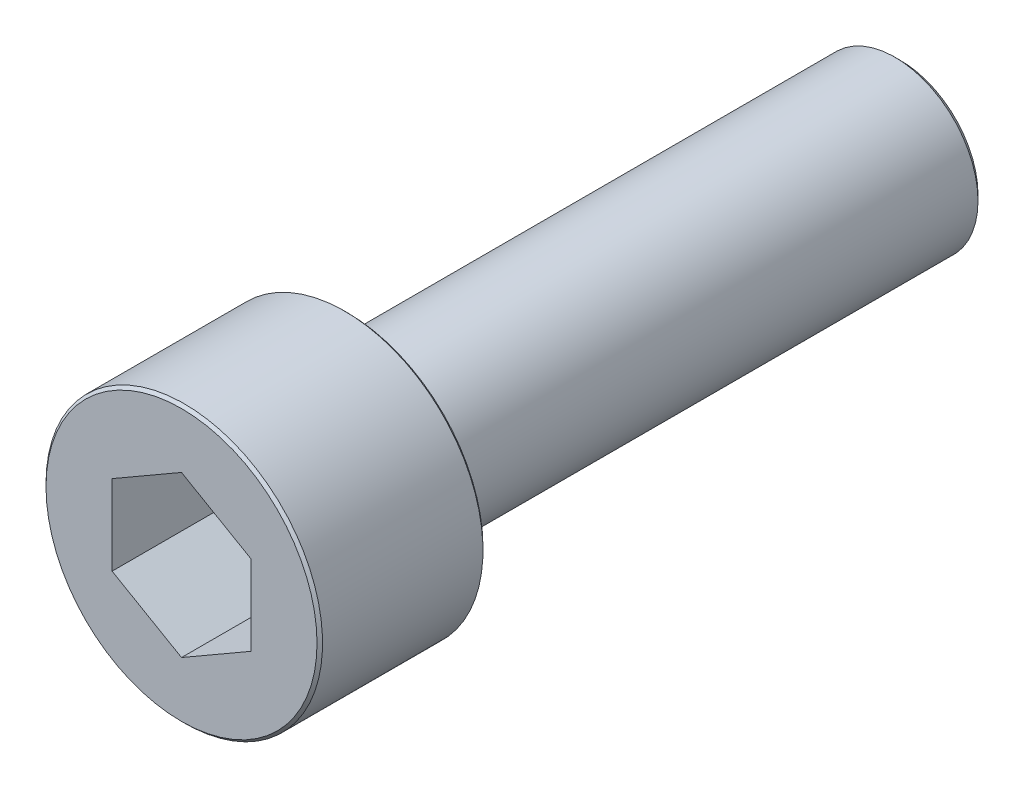
ISO-10303-21;
HEADER;
FILE_DESCRIPTION(('STEP AP214'),'2;1');
FILE_NAME('part.step','',(''),(''),'','','');
FILE_SCHEMA(('AUTOMOTIVE_DESIGN { 1 0 10303 214 1 1 1 1 }'));
ENDSEC;
DATA;
#1=APPLICATION_CONTEXT('core data for automotive mechanical design processes');
#2=APPLICATION_PROTOCOL_DEFINITION('international standard','automotive_design',2000,#1);
#3=PRODUCT_CONTEXT('',#1,'mechanical');
#4=PRODUCT('Part','Part','',(#3));
#5=PRODUCT_RELATED_PRODUCT_CATEGORY('part','',(#4));
#6=PRODUCT_DEFINITION_FORMATION('','',#4);
#7=PRODUCT_DEFINITION_CONTEXT('part definition',#1,'design');
#8=PRODUCT_DEFINITION('design','',#6,#7);
#9=PRODUCT_DEFINITION_SHAPE('','',#8);
#10=(LENGTH_UNIT() NAMED_UNIT(*) SI_UNIT(.MILLI.,.METRE.));
#11=(NAMED_UNIT(*) PLANE_ANGLE_UNIT() SI_UNIT($,.RADIAN.));
#12=(NAMED_UNIT(*) SI_UNIT($,.STERADIAN.) SOLID_ANGLE_UNIT());
#13=UNCERTAINTY_MEASURE_WITH_UNIT(LENGTH_MEASURE(1.E-05),#10,'distance_accuracy_value','');
#14=(GEOMETRIC_REPRESENTATION_CONTEXT(3) GLOBAL_UNCERTAINTY_ASSIGNED_CONTEXT((#13)) GLOBAL_UNIT_ASSIGNED_CONTEXT((#10,
#11,#12)) REPRESENTATION_CONTEXT('',''));
#15=CARTESIAN_POINT('',(0.,0.,0.));
#16=DIRECTION('',(0.,0.,1.));
#17=DIRECTION('',(1.,0.,0.));
#18=AXIS2_PLACEMENT_3D('',#15,#16,#17);
#19=CARTESIAN_POINT('',(0.,0.,20.));
#20=DIRECTION('',(0.,0.,1.));
#21=DIRECTION('',(1.,0.,0.));
#22=AXIS2_PLACEMENT_3D('',#19,#20,#21);
#23=CYLINDRICAL_SURFACE('',#22,5.);
#24=CARTESIAN_POINT('',(0.,0.,20.0999996906972));
#25=DIRECTION('',(0.,0.,-1.));
#26=DIRECTION('',(-1.,0.,0.));
#27=AXIS2_PLACEMENT_3D('',#24,#25,#26);
#28=CIRCLE('',#27,5.);
#29=CARTESIAN_POINT('',(-5.,0.,20.0999996906972));
#30=VERTEX_POINT('',#29);
#31=EDGE_CURVE('E154',#30,#30,#28,.F.);
#32=ORIENTED_EDGE('',*,*,#31,.T.);
#33=EDGE_LOOP('',(#32));
#34=FACE_BOUND('',#33,.T.);
#35=CARTESIAN_POINT('',(0.,0.,25.9000003552883));
#36=DIRECTION('',(0.,0.,1.));
#37=DIRECTION('',(1.,0.,0.));
#38=AXIS2_PLACEMENT_3D('',#35,#36,#37);
#39=CIRCLE('',#38,5.);
#40=CARTESIAN_POINT('',(-5.,0.,25.9000003552883));
#41=VERTEX_POINT('',#40);
#42=EDGE_CURVE('E151',#41,#41,#39,.F.);
#43=ORIENTED_EDGE('',*,*,#42,.T.);
#44=EDGE_LOOP('',(#43));
#45=FACE_BOUND('',#44,.T.);
#46=ADVANCED_FACE('F40',(#34,#45),#23,.T.);
#47=CARTESIAN_POINT('',(5.,0.,20.));
#48=DIRECTION('',(0.,0.,-1.));
#49=DIRECTION('',(-1.,0.,0.));
#50=AXIS2_PLACEMENT_3D('',#47,#48,#49);
#51=PLANE('',#50);
#52=CARTESIAN_POINT('',(0.,0.,20.));
#53=DIRECTION('',(0.,0.,-1.));
#54=DIRECTION('',(-1.,0.,0.));
#55=AXIS2_PLACEMENT_3D('',#52,#53,#54);
#56=CIRCLE('',#55,4.90000035528828);
#57=CARTESIAN_POINT('',(-4.90000035528828,0.,20.));
#58=VERTEX_POINT('',#57);
#59=EDGE_CURVE('E157',#58,#58,#56,.T.);
#60=ORIENTED_EDGE('',*,*,#59,.T.);
#61=EDGE_LOOP('',(#60));
#62=FACE_BOUND('',#61,.T.);
#63=CARTESIAN_POINT('',(0.,0.,20.));
#64=DIRECTION('',(0.,0.,-1.));
#65=DIRECTION('',(-1.,0.,0.));
#66=AXIS2_PLACEMENT_3D('',#63,#64,#65);
#67=CIRCLE('',#66,3.);
#68=CARTESIAN_POINT('',(-3.,0.,20.));
#69=VERTEX_POINT('',#68);
#70=EDGE_CURVE('E143',#69,#69,#67,.T.);
#71=ORIENTED_EDGE('',*,*,#70,.F.);
#72=EDGE_LOOP('',(#71));
#73=FACE_BOUND('',#72,.T.);
#74=ADVANCED_FACE('F177',(#62,#73),#51,.T.);
#75=CARTESIAN_POINT('',(0.,0.,26.));
#76=DIRECTION('',(0.,0.,1.));
#77=DIRECTION('',(1.,0.,0.));
#78=AXIS2_PLACEMENT_3D('',#75,#76,#77);
#79=PLANE('',#78);
#80=CARTESIAN_POINT('',(0.,0.,26.));
#81=DIRECTION('',(0.,0.,1.));
#82=DIRECTION('',(1.,0.,0.));
#83=AXIS2_PLACEMENT_3D('',#80,#81,#82);
#84=CIRCLE('',#83,4.90000030930282);
#85=CARTESIAN_POINT('',(-4.90000030930282,0.,26.));
#86=VERTEX_POINT('',#85);
#87=EDGE_CURVE('E160',#86,#86,#84,.T.);
#88=ORIENTED_EDGE('',*,*,#87,.T.);
#89=EDGE_LOOP('',(#88));
#90=FACE_BOUND('',#89,.T.);
#91=DIRECTION('',(0.,-1.,0.));
#92=VECTOR('',#91,1.);
#93=CARTESIAN_POINT('',(-2.51,1.449149175666,26.));
#94=LINE('',#93,#92);
#95=CARTESIAN_POINT('',(-2.51,1.449149175666,26.));
#96=VERTEX_POINT('',#95);
#97=CARTESIAN_POINT('',(-2.51,-1.449149175666,26.));
#98=VERTEX_POINT('',#97);
#99=EDGE_CURVE('E56',#96,#98,#94,.T.);
#100=ORIENTED_EDGE('',*,*,#99,.F.);
#101=DIRECTION('',(-0.866025403784431,-0.500000000000014,0.));
#102=VECTOR('',#101,1.);
#103=CARTESIAN_POINT('',(0.,2.89829835133201,26.));
#104=LINE('',#103,#102);
#105=CARTESIAN_POINT('',(0.,2.89829835133201,26.));
#106=VERTEX_POINT('',#105);
#107=EDGE_CURVE('E139',#106,#96,#104,.T.);
#108=ORIENTED_EDGE('',*,*,#107,.F.);
#109=DIRECTION('',(-0.866025403784431,0.500000000000014,0.));
#110=VECTOR('',#109,1.);
#111=CARTESIAN_POINT('',(2.51,1.449149175666,26.));
#112=LINE('',#111,#110);
#113=CARTESIAN_POINT('',(2.51,1.449149175666,26.));
#114=VERTEX_POINT('',#113);
#115=EDGE_CURVE('E137',#114,#106,#112,.T.);
#116=ORIENTED_EDGE('',*,*,#115,.F.);
#117=DIRECTION('',(0.,1.,0.));
#118=VECTOR('',#117,1.);
#119=CARTESIAN_POINT('',(2.51,-1.449149175666,26.));
#120=LINE('',#119,#118);
#121=CARTESIAN_POINT('',(2.51,-1.449149175666,26.));
#122=VERTEX_POINT('',#121);
#123=EDGE_CURVE('E104',#122,#114,#120,.T.);
#124=ORIENTED_EDGE('',*,*,#123,.F.);
#125=DIRECTION('',(0.866025403784431,0.500000000000013,0.));
#126=VECTOR('',#125,1.);
#127=CARTESIAN_POINT('',(0.,-2.898298351332,26.));
#128=LINE('',#127,#126);
#129=CARTESIAN_POINT('',(0.,-2.898298351332,26.));
#130=VERTEX_POINT('',#129);
#131=EDGE_CURVE('E133',#130,#122,#128,.T.);
#132=ORIENTED_EDGE('',*,*,#131,.F.);
#133=DIRECTION('',(0.866025403784432,-0.500000000000012,0.));
#134=VECTOR('',#133,1.);
#135=CARTESIAN_POINT('',(-2.51,-1.449149175666,26.));
#136=LINE('',#135,#134);
#137=EDGE_CURVE('E130',#98,#130,#136,.T.);
#138=ORIENTED_EDGE('',*,*,#137,.F.);
#139=EDGE_LOOP('',(#100,#108,#116,#124,#132,#138));
#140=FACE_BOUND('',#139,.T.);
#141=ADVANCED_FACE('F183',(#90,#140),#79,.T.);
#142=CARTESIAN_POINT('',(0.,0.,0.));
#143=DIRECTION('',(0.,0.,1.));
#144=DIRECTION('',(1.,0.,0.));
#145=AXIS2_PLACEMENT_3D('',#142,#143,#144);
#146=CYLINDRICAL_SURFACE('',#145,3.);
#147=CARTESIAN_POINT('',(0.,0.,0.200024765709059));
#148=DIRECTION('',(0.,0.,-1.));
#149=DIRECTION('',(-1.,0.,0.));
#150=AXIS2_PLACEMENT_3D('',#147,#148,#149);
#151=CIRCLE('',#150,3.);
#152=CARTESIAN_POINT('',(3.,0.,0.200024765709059));
#153=VERTEX_POINT('',#152);
#154=EDGE_CURVE('E11',#153,#153,#151,.F.);
#155=ORIENTED_EDGE('',*,*,#154,.T.);
#156=EDGE_LOOP('',(#155));
#157=FACE_BOUND('',#156,.T.);
#158=ORIENTED_EDGE('',*,*,#70,.T.);
#159=EDGE_LOOP('',(#158));
#160=FACE_BOUND('',#159,.T.);
#161=ADVANCED_FACE('F210',(#157,#160),#146,.T.);
#162=CARTESIAN_POINT('',(0.,0.,0.));
#163=DIRECTION('',(0.,0.,-1.));
#164=DIRECTION('',(-1.,0.,0.));
#165=AXIS2_PLACEMENT_3D('',#162,#163,#164);
#166=PLANE('',#165);
#167=CARTESIAN_POINT('',(0.,0.,0.));
#168=DIRECTION('',(0.,0.,-1.));
#169=DIRECTION('',(-1.,0.,0.));
#170=AXIS2_PLACEMENT_3D('',#167,#168,#169);
#171=CIRCLE('',#170,2.79997688554049);
#172=CARTESIAN_POINT('',(2.79997688554049,0.,0.));
#173=VERTEX_POINT('',#172);
#174=EDGE_CURVE('E49',#173,#173,#171,.T.);
#175=ORIENTED_EDGE('',*,*,#174,.T.);
#176=EDGE_LOOP('',(#175));
#177=FACE_BOUND('',#176,.T.);
#178=ADVANCED_FACE('F165',(#177),#166,.T.);
#179=CARTESIAN_POINT('',(-2.51,1.449149175666,21.5));
#180=DIRECTION('',(-1.,0.,0.));
#181=DIRECTION('',(0.,-1.,0.));
#182=AXIS2_PLACEMENT_3D('',#179,#180,#181);
#183=PLANE('',#182);
#184=ORIENTED_EDGE('',*,*,#99,.T.);
#185=DIRECTION('',(0.,0.,1.));
#186=VECTOR('',#185,1.);
#187=CARTESIAN_POINT('',(-2.51,-1.449149175666,21.5));
#188=LINE('',#187,#186);
#189=CARTESIAN_POINT('',(-2.51,-1.449149175666,21.5));
#190=VERTEX_POINT('',#189);
#191=EDGE_CURVE('E86',#190,#98,#188,.T.);
#192=ORIENTED_EDGE('',*,*,#191,.F.);
#193=DIRECTION('',(0.,-1.,0.));
#194=VECTOR('',#193,1.);
#195=CARTESIAN_POINT('',(-2.51,1.449149175666,21.5));
#196=LINE('',#195,#194);
#197=CARTESIAN_POINT('',(-2.51,1.449149175666,21.5));
#198=VERTEX_POINT('',#197);
#199=EDGE_CURVE('E141',#198,#190,#196,.T.);
#200=ORIENTED_EDGE('',*,*,#199,.F.);
#201=DIRECTION('',(0.,0.,1.));
#202=VECTOR('',#201,1.);
#203=CARTESIAN_POINT('',(-2.51,1.449149175666,21.5));
#204=LINE('',#203,#202);
#205=EDGE_CURVE('E64',#198,#96,#204,.T.);
#206=ORIENTED_EDGE('',*,*,#205,.T.);
#207=EDGE_LOOP('',(#184,#192,#200,#206));
#208=FACE_BOUND('',#207,.T.);
#209=ADVANCED_FACE('F218',(#208),#183,.F.);
#210=CARTESIAN_POINT('',(0.,2.89829835133201,21.5));
#211=DIRECTION('',(-0.500000000000014,0.866025403784431,0.));
#212=DIRECTION('',(-0.866025403784431,-0.500000000000014,0.));
#213=AXIS2_PLACEMENT_3D('',#210,#211,#212);
#214=PLANE('',#213);
#215=ORIENTED_EDGE('',*,*,#107,.T.);
#216=ORIENTED_EDGE('',*,*,#205,.F.);
#217=DIRECTION('',(-0.866025403784431,-0.500000000000014,0.));
#218=VECTOR('',#217,1.);
#219=CARTESIAN_POINT('',(0.,2.89829835133201,21.5));
#220=LINE('',#219,#218);
#221=CARTESIAN_POINT('',(0.,2.89829835133201,21.5));
#222=VERTEX_POINT('',#221);
#223=EDGE_CURVE('E116',#222,#198,#220,.T.);
#224=ORIENTED_EDGE('',*,*,#223,.F.);
#225=DIRECTION('',(0.,0.,1.));
#226=VECTOR('',#225,1.);
#227=CARTESIAN_POINT('',(0.,2.89829835133201,21.5));
#228=LINE('',#227,#226);
#229=EDGE_CURVE('E108',#222,#106,#228,.T.);
#230=ORIENTED_EDGE('',*,*,#229,.T.);
#231=EDGE_LOOP('',(#215,#216,#224,#230));
#232=FACE_BOUND('',#231,.T.);
#233=ADVANCED_FACE('F224',(#232),#214,.F.);
#234=CARTESIAN_POINT('',(2.51,1.449149175666,21.5));
#235=DIRECTION('',(0.500000000000014,0.866025403784431,0.));
#236=DIRECTION('',(-0.866025403784431,0.500000000000014,0.));
#237=AXIS2_PLACEMENT_3D('',#234,#235,#236);
#238=PLANE('',#237);
#239=ORIENTED_EDGE('',*,*,#115,.T.);
#240=ORIENTED_EDGE('',*,*,#229,.F.);
#241=DIRECTION('',(-0.866025403784431,0.500000000000014,0.));
#242=VECTOR('',#241,1.);
#243=CARTESIAN_POINT('',(2.51,1.449149175666,21.5));
#244=LINE('',#243,#242);
#245=CARTESIAN_POINT('',(2.51,1.449149175666,21.5));
#246=VERTEX_POINT('',#245);
#247=EDGE_CURVE('E112',#246,#222,#244,.T.);
#248=ORIENTED_EDGE('',*,*,#247,.F.);
#249=DIRECTION('',(0.,0.,1.));
#250=VECTOR('',#249,1.);
#251=CARTESIAN_POINT('',(2.51,1.449149175666,21.5));
#252=LINE('',#251,#250);
#253=EDGE_CURVE('E97',#246,#114,#252,.T.);
#254=ORIENTED_EDGE('',*,*,#253,.T.);
#255=EDGE_LOOP('',(#239,#240,#248,#254));
#256=FACE_BOUND('',#255,.T.);
#257=ADVANCED_FACE('F113',(#256),#238,.F.);
#258=CARTESIAN_POINT('',(2.51,-1.449149175666,21.5));
#259=DIRECTION('',(1.,0.,0.));
#260=DIRECTION('',(0.,1.,0.));
#261=AXIS2_PLACEMENT_3D('',#258,#259,#260);
#262=PLANE('',#261);
#263=ORIENTED_EDGE('',*,*,#123,.T.);
#264=ORIENTED_EDGE('',*,*,#253,.F.);
#265=DIRECTION('',(0.,1.,0.));
#266=VECTOR('',#265,1.);
#267=CARTESIAN_POINT('',(2.51,-1.449149175666,21.5));
#268=LINE('',#267,#266);
#269=CARTESIAN_POINT('',(2.51,-1.449149175666,21.5));
#270=VERTEX_POINT('',#269);
#271=EDGE_CURVE('E101',#270,#246,#268,.T.);
#272=ORIENTED_EDGE('',*,*,#271,.F.);
#273=DIRECTION('',(0.,0.,1.));
#274=VECTOR('',#273,1.);
#275=CARTESIAN_POINT('',(2.51,-1.449149175666,21.5));
#276=LINE('',#275,#274);
#277=EDGE_CURVE('E109',#270,#122,#276,.T.);
#278=ORIENTED_EDGE('',*,*,#277,.T.);
#279=EDGE_LOOP('',(#263,#264,#272,#278));
#280=FACE_BOUND('',#279,.T.);
#281=ADVANCED_FACE('F99',(#280),#262,.F.);
#282=CARTESIAN_POINT('',(0.,-2.898298351332,21.5));
#283=DIRECTION('',(0.500000000000013,-0.866025403784431,0.));
#284=DIRECTION('',(0.866025403784431,0.500000000000013,0.));
#285=AXIS2_PLACEMENT_3D('',#282,#283,#284);
#286=PLANE('',#285);
#287=ORIENTED_EDGE('',*,*,#131,.T.);
#288=ORIENTED_EDGE('',*,*,#277,.F.);
#289=DIRECTION('',(0.866025403784431,0.500000000000013,0.));
#290=VECTOR('',#289,1.);
#291=CARTESIAN_POINT('',(0.,-2.898298351332,21.5));
#292=LINE('',#291,#290);
#293=CARTESIAN_POINT('',(0.,-2.898298351332,21.5));
#294=VERTEX_POINT('',#293);
#295=EDGE_CURVE('E122',#294,#270,#292,.T.);
#296=ORIENTED_EDGE('',*,*,#295,.F.);
#297=DIRECTION('',(0.,0.,1.));
#298=VECTOR('',#297,1.);
#299=CARTESIAN_POINT('',(0.,-2.898298351332,21.5));
#300=LINE('',#299,#298);
#301=EDGE_CURVE('E146',#294,#130,#300,.T.);
#302=ORIENTED_EDGE('',*,*,#301,.T.);
#303=EDGE_LOOP('',(#287,#288,#296,#302));
#304=FACE_BOUND('',#303,.T.);
#305=ADVANCED_FACE('F227',(#304),#286,.F.);
#306=CARTESIAN_POINT('',(-2.51,-1.449149175666,21.5));
#307=DIRECTION('',(-0.500000000000012,-0.866025403784432,0.));
#308=DIRECTION('',(0.866025403784432,-0.500000000000012,0.));
#309=AXIS2_PLACEMENT_3D('',#306,#307,#308);
#310=PLANE('',#309);
#311=ORIENTED_EDGE('',*,*,#137,.T.);
#312=ORIENTED_EDGE('',*,*,#301,.F.);
#313=DIRECTION('',(0.866025403784432,-0.500000000000012,0.));
#314=VECTOR('',#313,1.);
#315=CARTESIAN_POINT('',(-2.51,-1.449149175666,21.5));
#316=LINE('',#315,#314);
#317=EDGE_CURVE('E124',#190,#294,#316,.T.);
#318=ORIENTED_EDGE('',*,*,#317,.F.);
#319=ORIENTED_EDGE('',*,*,#191,.T.);
#320=EDGE_LOOP('',(#311,#312,#318,#319));
#321=FACE_BOUND('',#320,.T.);
#322=ADVANCED_FACE('F202',(#321),#310,.F.);
#323=CARTESIAN_POINT('',(0.,0.,21.5));
#324=DIRECTION('',(0.,0.,1.));
#325=DIRECTION('',(1.,0.,0.));
#326=AXIS2_PLACEMENT_3D('',#323,#324,#325);
#327=PLANE('',#326);
#328=ORIENTED_EDGE('',*,*,#199,.T.);
#329=ORIENTED_EDGE('',*,*,#317,.T.);
#330=ORIENTED_EDGE('',*,*,#295,.T.);
#331=ORIENTED_EDGE('',*,*,#271,.T.);
#332=ORIENTED_EDGE('',*,*,#247,.T.);
#333=ORIENTED_EDGE('',*,*,#223,.T.);
#334=EDGE_LOOP('',(#328,#329,#330,#331,#332,#333));
#335=FACE_BOUND('',#334,.T.);
#336=ADVANCED_FACE('F119',(#335),#327,.T.);
#337=CARTESIAN_POINT('',(0.,0.,20.0999996906972));
#338=DIRECTION('',(0.,0.,1.));
#339=DIRECTION('',(1.,0.,0.));
#340=AXIS2_PLACEMENT_3D('',#337,#338,#339);
#341=CONICAL_SURFACE('',#340,5.,0.785397933469422);
#342=ORIENTED_EDGE('',*,*,#59,.F.);
#343=EDGE_LOOP('',(#342));
#344=FACE_BOUND('',#343,.T.);
#345=ORIENTED_EDGE('',*,*,#31,.F.);
#346=EDGE_LOOP('',(#345));
#347=FACE_BOUND('',#346,.T.);
#348=ADVANCED_FACE('F173',(#344,#347),#341,.T.);
#349=CARTESIAN_POINT('',(0.,0.,26.));
#350=DIRECTION('',(0.,0.,-1.));
#351=DIRECTION('',(-1.,0.,0.));
#352=AXIS2_PLACEMENT_3D('',#349,#350,#351);
#353=CONICAL_SURFACE('',#352,4.90000030930282,0.785398393325483);
#354=CARTESIAN_POINT('',(-5.,0.,25.9000003552883));
#355=CARTESIAN_POINT('',(-4.99895833655524,0.,25.901042018254));
#356=CARTESIAN_POINT('',(-4.99791667311048,0.,25.9020836812198));
#357=CARTESIAN_POINT('',(-4.99583334622095,0.,25.9041670071513));
#358=CARTESIAN_POINT('',(-4.99479168277619,0.,25.905208670117));
#359=CARTESIAN_POINT('',(-4.99270835588667,0.,25.9072919960485));
#360=CARTESIAN_POINT('',(-4.9916666924419,0.,25.9083336590142));
#361=CARTESIAN_POINT('',(-4.98958336555238,0.,25.9104169849457));
#362=CARTESIAN_POINT('',(-4.98854170210762,0.,25.9114586479115));
#363=CARTESIAN_POINT('',(-4.98645837521809,0.,25.913541973843));
#364=CARTESIAN_POINT('',(-4.98541671177333,0.,25.9145836368087));
#365=CARTESIAN_POINT('',(-4.9833333848838,0.,25.9166669627402));
#366=CARTESIAN_POINT('',(-4.98229172143904,0.,25.917708625706));
#367=CARTESIAN_POINT('',(-4.98020839454952,0.,25.9197919516375));
#368=CARTESIAN_POINT('',(-4.97916673110475,0.,25.9208336146032));
#369=CARTESIAN_POINT('',(-4.97708340421523,0.,25.9229169405347));
#370=CARTESIAN_POINT('',(-4.97604174077047,0.,25.9239586035005));
#371=CARTESIAN_POINT('',(-4.97395841388094,0.,25.926041929432));
#372=CARTESIAN_POINT('',(-4.97291675043618,0.,25.9270835923977));
#373=CARTESIAN_POINT('',(-4.97083342354666,0.,25.9291669183292));
#374=CARTESIAN_POINT('',(-4.96979176010189,0.,25.9302085812949));
#375=CARTESIAN_POINT('',(-4.96770843321237,0.,25.9322919072264));
#376=CARTESIAN_POINT('',(-4.96666676976761,0.,25.9333335701922));
#377=CARTESIAN_POINT('',(-4.96458344287808,0.,25.9354168961237));
#378=CARTESIAN_POINT('',(-4.96354177943332,0.,25.9364585590894));
#379=CARTESIAN_POINT('',(-4.9614584525438,0.,25.9385418850209));
#380=CARTESIAN_POINT('',(-4.96041678909903,0.,25.9395835479867));
#381=CARTESIAN_POINT('',(-4.95833346220951,0.,25.9416668739182));
#382=CARTESIAN_POINT('',(-4.95729179876475,0.,25.9427085368839));
#383=CARTESIAN_POINT('',(-4.95520847187522,0.,25.9447918628154));
#384=CARTESIAN_POINT('',(-4.95416680843046,0.,25.9458335257811));
#385=CARTESIAN_POINT('',(-4.95208348154094,0.,25.9479168517126));
#386=CARTESIAN_POINT('',(-4.95104181809617,0.,25.9489585146784));
#387=CARTESIAN_POINT('',(-4.94895849120665,0.,25.9510418406099));
#388=CARTESIAN_POINT('',(-4.94791682776189,0.,25.9520835035756));
#389=CARTESIAN_POINT('',(-4.94583350087236,0.,25.9541668295071));
#390=CARTESIAN_POINT('',(-4.9447918374276,0.,25.9552084924729));
#391=CARTESIAN_POINT('',(-4.94270851053807,0.,25.9572918184044));
#392=CARTESIAN_POINT('',(-4.94166684709331,0.,25.9583334813701));
#393=CARTESIAN_POINT('',(-4.93958352020379,0.,25.9604168073016));
#394=CARTESIAN_POINT('',(-4.93854185675903,0.,25.9614584702674));
#395=CARTESIAN_POINT('',(-4.9364585298695,0.,25.9635417961989));
#396=CARTESIAN_POINT('',(-4.93541686642474,0.,25.9645834591646));
#397=CARTESIAN_POINT('',(-4.93333353953521,0.,25.9666667850961));
#398=CARTESIAN_POINT('',(-4.93229187609045,0.,25.9677084480618));
#399=CARTESIAN_POINT('',(-4.93020854920093,0.,25.9697917739933));
#400=CARTESIAN_POINT('',(-4.92916688575616,0.,25.9708334369591));
#401=CARTESIAN_POINT('',(-4.92708355886664,0.,25.9729167628906));
#402=CARTESIAN_POINT('',(-4.92604189542188,0.,25.9739584258563));
#403=CARTESIAN_POINT('',(-4.92395856853235,0.,25.9760417517878));
#404=CARTESIAN_POINT('',(-4.92291690508759,0.,25.9770834147536));
#405=CARTESIAN_POINT('',(-4.92083357819807,0.,25.9791667406851));
#406=CARTESIAN_POINT('',(-4.9197919147533,0.,25.9802084036508));
#407=CARTESIAN_POINT('',(-4.91770858786378,0.,25.9822917295823));
#408=CARTESIAN_POINT('',(-4.91666692441902,0.,25.983333392548));
#409=CARTESIAN_POINT('',(-4.91458359752949,0.,25.9854167184795));
#410=CARTESIAN_POINT('',(-4.91354193408473,0.,25.9864583814453));
#411=CARTESIAN_POINT('',(-4.9114586071952,0.,25.9885417073768));
#412=CARTESIAN_POINT('',(-4.91041694375044,0.,25.9895833703425));
#413=CARTESIAN_POINT('',(-4.90833361686092,0.,25.991666696274));
#414=CARTESIAN_POINT('',(-4.90729195341616,0.,25.9927083592398));
#415=CARTESIAN_POINT('',(-4.90520862652663,0.,25.9947916851713));
#416=CARTESIAN_POINT('',(-4.90416696308187,0.,25.995833348137));
#417=CARTESIAN_POINT('',(-4.90208363619234,0.,25.9979166740685));
#418=CARTESIAN_POINT('',(-4.90104197274758,0.,25.9989583370343));
#419=CARTESIAN_POINT('',(-4.90000030930282,0.,26.));
#420=B_SPLINE_CURVE_WITH_KNOTS('',3,(#354,#355,#356,#357,#358,#359,#360,#361,#362,#363,#364,
#365,#366,#367,#368,#369,#370,#371,#372,#373,#374,#375,#376,#377,#378,#379,#380,#381,#382,#383,
#384,#385,#386,#387,#388,#389,#390,#391,#392,#393,#394,#395,#396,#397,#398,#399,#400,#401,#402,
#403,#404,#405,#406,#407,#408,#409,#410,#411,#412,#413,#414,#415,#416,#417,#418,#419),
.UNSPECIFIED.,.F.,.F.,(4,2,2,2,2,2,2,2,2,2,2,2,2,2,2,2,2,2,2,2,2,2,2,2,2,2,2,2,2,2,2,2,4),(0.,
0.00441940269688693,0.00883880539377632,0.0132582080906657,0.0176776107875551,
0.0220970134844445,0.0265164161813339,0.0309358188782208,0.0353552215751102,0.0397746242719996,
0.0441940269688889,0.0486134296657783,0.0530328323626677,0.0574522350595546,0.061871637756444,
0.0662910404533334,0.0707104431502222,0.0751298458471116,0.079549248544001,0.0839686512408903,
0.0883880539377773,0.0928074566346666,0.097226859331556,0.101646262028445,0.106065664725335,
0.110485067422224,0.114904470119111,0.119323872816001,0.12374327551289,0.128162678209779,
0.132582080906669,0.137001483603558,0.141420886300447),.UNSPECIFIED.);
#421=EDGE_CURVE('BSEAM168',#41,#86,#420,.T.);
#422=ORIENTED_EDGE('',*,*,#42,.F.);
#423=ORIENTED_EDGE('',*,*,#87,.F.);
#424=ORIENTED_EDGE('',*,*,#421,.T.);
#425=ORIENTED_EDGE('',*,*,#421,.F.);
#426=EDGE_LOOP('',(#422,#424,#423,#425));
#427=FACE_BOUND('',#426,.T.);
#428=ADVANCED_FACE('F168',(#427),#353,.T.);
#429=CARTESIAN_POINT('',(0.,0.,0.));
#430=DIRECTION('',(0.,0.,1.));
#431=DIRECTION('',(1.,0.,0.));
#432=AXIS2_PLACEMENT_3D('',#429,#430,#431);
#433=CONICAL_SURFACE('',#432,2.79997688554049,0.785394035767646);
#434=CARTESIAN_POINT('',(3.,0.,0.200024765709059));
#435=CARTESIAN_POINT('',(2.99791642589105,0.,0.197941174399589));
#436=CARTESIAN_POINT('',(2.99583285178209,0.,0.19585758309012));
#437=CARTESIAN_POINT('',(2.99166570356419,0.,0.191690400471181));
#438=CARTESIAN_POINT('',(2.98958212945523,0.,0.189606809161712));
#439=CARTESIAN_POINT('',(2.98541498123733,0.,0.185439626542773));
#440=CARTESIAN_POINT('',(2.98333140712837,0.,0.183356035233304));
#441=CARTESIAN_POINT('',(2.97916425891047,0.,0.179188852614365));
#442=CARTESIAN_POINT('',(2.97708068480151,0.,0.177105261304896));
#443=CARTESIAN_POINT('',(2.97291353658361,0.,0.172938078685957));
#444=CARTESIAN_POINT('',(2.97082996247466,0.,0.170854487376488));
#445=CARTESIAN_POINT('',(2.96666281425675,0.,0.166687304757549));
#446=CARTESIAN_POINT('',(2.9645792401478,0.,0.16460371344808));
#447=CARTESIAN_POINT('',(2.96041209192989,0.,0.160436530829141));
#448=CARTESIAN_POINT('',(2.95832851782094,0.,0.158352939519671));
#449=CARTESIAN_POINT('',(2.95416136960303,0.,0.154185756900733));
#450=CARTESIAN_POINT('',(2.95207779549408,0.,0.152102165591263));
#451=CARTESIAN_POINT('',(2.94791064727617,0.,0.147934982972325));
#452=CARTESIAN_POINT('',(2.94582707316722,0.,0.145851391662855));
#453=CARTESIAN_POINT('',(2.94165992494931,0.,0.141684209043917));
#454=CARTESIAN_POINT('',(2.93957635084036,0.,0.139600617734447));
#455=CARTESIAN_POINT('',(2.93540920262245,0.,0.135433435115509));
#456=CARTESIAN_POINT('',(2.9333256285135,0.,0.133349843806039));
#457=CARTESIAN_POINT('',(2.92915848029559,0.,0.1291826611871));
#458=CARTESIAN_POINT('',(2.92707490618664,0.,0.127099069877631));
#459=CARTESIAN_POINT('',(2.92290775796873,0.,0.122931887258692));
#460=CARTESIAN_POINT('',(2.92082418385978,0.,0.120848295949223));
#461=CARTESIAN_POINT('',(2.91665703564187,0.,0.116681113330284));
#462=CARTESIAN_POINT('',(2.91457346153292,0.,0.114597522020815));
#463=CARTESIAN_POINT('',(2.91040631331501,0.,0.110430339401876));
#464=CARTESIAN_POINT('',(2.90832273920606,0.,0.108346748092407));
#465=CARTESIAN_POINT('',(2.90415559098815,0.,0.104179565473468));
#466=CARTESIAN_POINT('',(2.9020720168792,0.,0.102095974163999));
#467=CARTESIAN_POINT('',(2.89790486866129,0.,0.09792879154506));
#468=CARTESIAN_POINT('',(2.89582129455234,0.,0.0958452002355907));
#469=CARTESIAN_POINT('',(2.89165414633443,0.,0.091678017616652));
#470=CARTESIAN_POINT('',(2.88957057222548,0.,0.0895944263071826));
#471=CARTESIAN_POINT('',(2.88540342400757,0.,0.0854272436882438));
#472=CARTESIAN_POINT('',(2.88331984989862,0.,0.0833436523787745));
#473=CARTESIAN_POINT('',(2.87915270168072,0.,0.0791764697598357));
#474=CARTESIAN_POINT('',(2.87706912757176,0.,0.0770928784503664));
#475=CARTESIAN_POINT('',(2.87290197935386,0.,0.0729256958314277));
#476=CARTESIAN_POINT('',(2.8708184052449,0.,0.0708421045219583));
#477=CARTESIAN_POINT('',(2.866651257027,0.,0.0666749219030196));
#478=CARTESIAN_POINT('',(2.86456768291804,0.,0.0645913305935502));
#479=CARTESIAN_POINT('',(2.86040053470014,0.,0.0604241479746115));
#480=CARTESIAN_POINT('',(2.85831696059118,0.,0.0583405566651421));
#481=CARTESIAN_POINT('',(2.85414981237328,0.,0.0541733740462034));
#482=CARTESIAN_POINT('',(2.85206623826432,0.,0.052089782736734));
#483=CARTESIAN_POINT('',(2.84789909004642,0.,0.0479226001177953));
#484=CARTESIAN_POINT('',(2.84581551593746,0.,0.045839008808326));
#485=CARTESIAN_POINT('',(2.84164836771956,0.,0.0416718261893872));
#486=CARTESIAN_POINT('',(2.8395647936106,0.,0.0395882348799178));
#487=CARTESIAN_POINT('',(2.8353976453927,0.,0.0354210522609791));
#488=CARTESIAN_POINT('',(2.83331407128374,0.,0.0333374609515098));
#489=CARTESIAN_POINT('',(2.82914692306584,0.,0.0291702783325711));
#490=CARTESIAN_POINT('',(2.82706334895689,0.,0.0270866870231017));
#491=CARTESIAN_POINT('',(2.82289620073898,0.,0.022919504404163));
#492=CARTESIAN_POINT('',(2.82081262663003,0.,0.0208359130946936));
#493=CARTESIAN_POINT('',(2.81664547841212,0.,0.0166687304757549));
#494=CARTESIAN_POINT('',(2.81456190430317,0.,0.0145851391662855));
#495=CARTESIAN_POINT('',(2.81039475608526,0.,0.0104179565473468));
#496=CARTESIAN_POINT('',(2.80831118197631,0.,0.00833436523787744));
#497=CARTESIAN_POINT('',(2.8041440337584,0.,0.00416718261893872));
#498=CARTESIAN_POINT('',(2.80206045964945,0.,0.00208359130946936));
#499=CARTESIAN_POINT('',(2.79997688554049,0.,0.));
#500=B_SPLINE_CURVE_WITH_KNOTS('',3,(#434,#435,#436,#437,#438,#439,#440,#441,#442,#443,#444,
#445,#446,#447,#448,#449,#450,#451,#452,#453,#454,#455,#456,#457,#458,#459,#460,#461,#462,#463,
#464,#465,#466,#467,#468,#469,#470,#471,#472,#473,#474,#475,#476,#477,#478,#479,#480,#481,#482,
#483,#484,#485,#486,#487,#488,#489,#490,#491,#492,#493,#494,#495,#496,#497,#498,#499),
.UNSPECIFIED.,.F.,.F.,(4,2,2,2,2,2,2,2,2,2,2,2,2,2,2,2,2,2,2,2,2,2,2,2,2,2,2,2,2,2,2,2,4),(0.,
0.00883989277715326,0.0176797855543065,0.0265196783314598,0.0353595711086131,0.0441994638857663,
0.0530393566629196,0.0618792494400731,0.0707191422172264,0.0795590349943797,0.0883989277715329,
0.0972388205486862,0.106078713325839,0.114918606102993,0.123758498880146,0.132598391657299,
0.141438284434453,0.150278177211606,0.159118069988759,0.167957962765913,0.176797855543066,
0.185637748320219,0.194477641097372,0.203317533874526,0.212157426651679,0.220997319428832,
0.229837212205986,0.238677104983139,0.247516997760292,0.256356890537446,0.265196783314599,
0.274036676091752,0.282876568868905),.UNSPECIFIED.);
#501=EDGE_CURVE('BSEAM43',#153,#173,#500,.T.);
#502=ORIENTED_EDGE('',*,*,#154,.F.);
#503=ORIENTED_EDGE('',*,*,#174,.F.);
#504=ORIENTED_EDGE('',*,*,#501,.T.);
#505=ORIENTED_EDGE('',*,*,#501,.F.);
#506=EDGE_LOOP('',(#502,#504,#503,#505));
#507=FACE_BOUND('',#506,.T.);
#508=ADVANCED_FACE('F43',(#507),#433,.T.);
#509=CLOSED_SHELL('',(#46,#74,#141,#161,#178,#209,#233,#257,#281,#305,#322,#336,#348,#428,#508));
#510=MANIFOLD_SOLID_BREP('B2',#509);
#511=ADVANCED_BREP_SHAPE_REPRESENTATION('',(#18,#510),#14);
#512=SHAPE_DEFINITION_REPRESENTATION(#9,#511);
ENDSEC;
END-ISO-10303-21;
